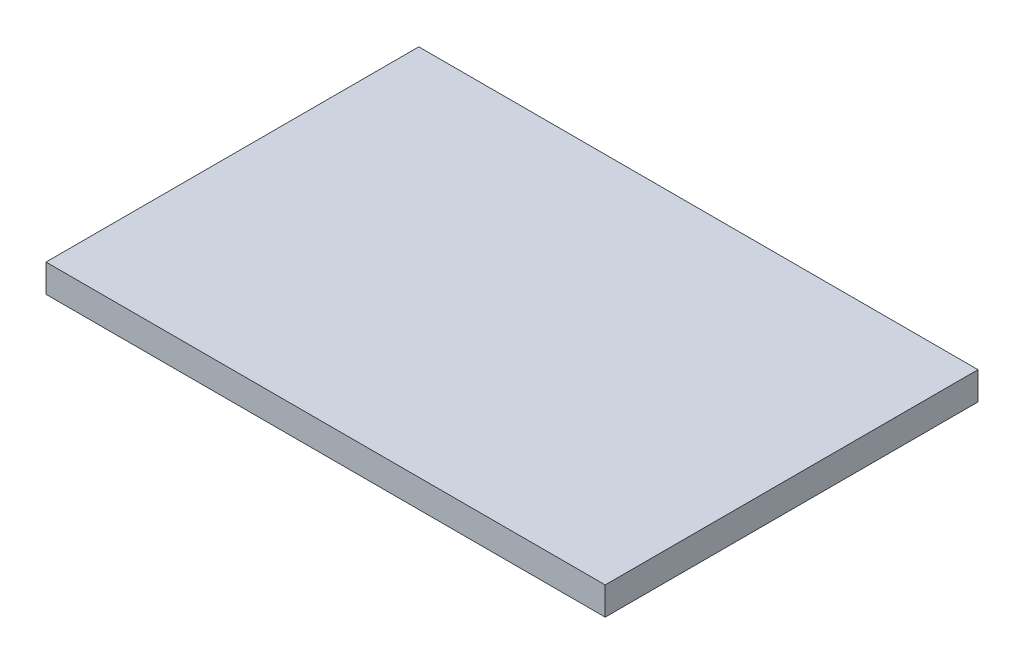
ISO-10303-21;
HEADER;
FILE_DESCRIPTION(('STEP AP214'),'2;1');
FILE_NAME('part.step','',(''),(''),'','','');
FILE_SCHEMA(('AUTOMOTIVE_DESIGN { 1 0 10303 214 1 1 1 1 }'));
ENDSEC;
DATA;
#1=APPLICATION_CONTEXT('core data for automotive mechanical design processes');
#2=APPLICATION_PROTOCOL_DEFINITION('international standard','automotive_design',2000,#1);
#3=PRODUCT_CONTEXT('',#1,'mechanical');
#4=PRODUCT('Part','Part','',(#3));
#5=PRODUCT_RELATED_PRODUCT_CATEGORY('part','',(#4));
#6=PRODUCT_DEFINITION_FORMATION('','',#4);
#7=PRODUCT_DEFINITION_CONTEXT('part definition',#1,'design');
#8=PRODUCT_DEFINITION('design','',#6,#7);
#9=PRODUCT_DEFINITION_SHAPE('','',#8);
#10=(LENGTH_UNIT() NAMED_UNIT(*) SI_UNIT(.MILLI.,.METRE.));
#11=(NAMED_UNIT(*) PLANE_ANGLE_UNIT() SI_UNIT($,.RADIAN.));
#12=(NAMED_UNIT(*) SI_UNIT($,.STERADIAN.) SOLID_ANGLE_UNIT());
#13=UNCERTAINTY_MEASURE_WITH_UNIT(LENGTH_MEASURE(1.E-05),#10,'distance_accuracy_value','');
#14=(GEOMETRIC_REPRESENTATION_CONTEXT(3) GLOBAL_UNCERTAINTY_ASSIGNED_CONTEXT((#13)) GLOBAL_UNIT_ASSIGNED_CONTEXT((#10,
#11,#12)) REPRESENTATION_CONTEXT('',''));
#15=CARTESIAN_POINT('',(0.,0.,0.));
#16=DIRECTION('',(0.,0.,1.));
#17=DIRECTION('',(1.,0.,0.));
#18=AXIS2_PLACEMENT_3D('',#15,#16,#17);
#19=CARTESIAN_POINT('',(30.,3.,20.));
#20=DIRECTION('',(-1.,0.,0.));
#21=DIRECTION('',(0.,0.,1.));
#22=AXIS2_PLACEMENT_3D('',#19,#20,#21);
#23=PLANE('',#22);
#24=DIRECTION('',(0.,0.,-1.));
#25=VECTOR('',#24,1.);
#26=CARTESIAN_POINT('',(30.,0.,20.));
#27=LINE('',#26,#25);
#28=CARTESIAN_POINT('',(30.,0.,20.));
#29=VERTEX_POINT('',#28);
#30=CARTESIAN_POINT('',(30.,0.,-20.));
#31=VERTEX_POINT('',#30);
#32=EDGE_CURVE('E111',#29,#31,#27,.T.);
#33=ORIENTED_EDGE('',*,*,#32,.T.);
#34=DIRECTION('',(0.,-1.,0.));
#35=VECTOR('',#34,1.);
#36=CARTESIAN_POINT('',(30.,3.,-20.));
#37=LINE('',#36,#35);
#38=CARTESIAN_POINT('',(30.,3.,-20.));
#39=VERTEX_POINT('',#38);
#40=EDGE_CURVE('E11',#39,#31,#37,.T.);
#41=ORIENTED_EDGE('',*,*,#40,.F.);
#42=DIRECTION('',(0.,0.,-1.));
#43=VECTOR('',#42,1.);
#44=CARTESIAN_POINT('',(30.,3.,20.));
#45=LINE('',#44,#43);
#46=CARTESIAN_POINT('',(30.,3.,20.));
#47=VERTEX_POINT('',#46);
#48=EDGE_CURVE('E95',#47,#39,#45,.T.);
#49=ORIENTED_EDGE('',*,*,#48,.F.);
#50=DIRECTION('',(0.,-1.,0.));
#51=VECTOR('',#50,1.);
#52=CARTESIAN_POINT('',(30.,3.,20.));
#53=LINE('',#52,#51);
#54=EDGE_CURVE('E107',#47,#29,#53,.T.);
#55=ORIENTED_EDGE('',*,*,#54,.T.);
#56=EDGE_LOOP('',(#33,#41,#49,#55));
#57=FACE_BOUND('',#56,.T.);
#58=ADVANCED_FACE('F43',(#57),#23,.F.);
#59=CARTESIAN_POINT('',(-30.,3.,-20.));
#60=DIRECTION('',(0.,0.,1.));
#61=DIRECTION('',(1.,0.,0.));
#62=AXIS2_PLACEMENT_3D('',#59,#60,#61);
#63=PLANE('',#62);
#64=DIRECTION('',(-1.,0.,0.));
#65=VECTOR('',#64,1.);
#66=CARTESIAN_POINT('',(-30.,0.,-20.));
#67=LINE('',#66,#65);
#68=CARTESIAN_POINT('',(-30.,0.,-20.));
#69=VERTEX_POINT('',#68);
#70=EDGE_CURVE('E100',#31,#69,#67,.T.);
#71=ORIENTED_EDGE('',*,*,#70,.T.);
#72=DIRECTION('',(0.,-1.,0.));
#73=VECTOR('',#72,1.);
#74=CARTESIAN_POINT('',(-30.,3.,-20.));
#75=LINE('',#74,#73);
#76=CARTESIAN_POINT('',(-30.,3.,-20.));
#77=VERTEX_POINT('',#76);
#78=EDGE_CURVE('E52',#77,#69,#75,.T.);
#79=ORIENTED_EDGE('',*,*,#78,.F.);
#80=DIRECTION('',(-1.,0.,0.));
#81=VECTOR('',#80,1.);
#82=CARTESIAN_POINT('',(-30.,3.,-20.));
#83=LINE('',#82,#81);
#84=EDGE_CURVE('E90',#39,#77,#83,.T.);
#85=ORIENTED_EDGE('',*,*,#84,.F.);
#86=ORIENTED_EDGE('',*,*,#40,.T.);
#87=EDGE_LOOP('',(#71,#79,#85,#86));
#88=FACE_BOUND('',#87,.T.);
#89=ADVANCED_FACE('F99',(#88),#63,.F.);
#90=CARTESIAN_POINT('',(-30.,3.,20.));
#91=DIRECTION('',(1.,0.,0.));
#92=DIRECTION('',(0.,0.,-1.));
#93=AXIS2_PLACEMENT_3D('',#90,#91,#92);
#94=PLANE('',#93);
#95=DIRECTION('',(0.,0.,1.));
#96=VECTOR('',#95,1.);
#97=CARTESIAN_POINT('',(-30.,0.,20.));
#98=LINE('',#97,#96);
#99=CARTESIAN_POINT('',(-30.,0.,20.));
#100=VERTEX_POINT('',#99);
#101=EDGE_CURVE('E77',#69,#100,#98,.T.);
#102=ORIENTED_EDGE('',*,*,#101,.T.);
#103=DIRECTION('',(0.,-1.,0.));
#104=VECTOR('',#103,1.);
#105=CARTESIAN_POINT('',(-30.,3.,20.));
#106=LINE('',#105,#104);
#107=CARTESIAN_POINT('',(-30.,3.,20.));
#108=VERTEX_POINT('',#107);
#109=EDGE_CURVE('E102',#108,#100,#106,.T.);
#110=ORIENTED_EDGE('',*,*,#109,.F.);
#111=DIRECTION('',(0.,0.,1.));
#112=VECTOR('',#111,1.);
#113=CARTESIAN_POINT('',(-30.,3.,20.));
#114=LINE('',#113,#112);
#115=EDGE_CURVE('E93',#77,#108,#114,.T.);
#116=ORIENTED_EDGE('',*,*,#115,.F.);
#117=ORIENTED_EDGE('',*,*,#78,.T.);
#118=EDGE_LOOP('',(#102,#110,#116,#117));
#119=FACE_BOUND('',#118,.T.);
#120=ADVANCED_FACE('F103',(#119),#94,.F.);
#121=CARTESIAN_POINT('',(-30.,3.,20.));
#122=DIRECTION('',(0.,0.,-1.));
#123=DIRECTION('',(-1.,0.,0.));
#124=AXIS2_PLACEMENT_3D('',#121,#122,#123);
#125=PLANE('',#124);
#126=DIRECTION('',(1.,0.,0.));
#127=VECTOR('',#126,1.);
#128=CARTESIAN_POINT('',(-30.,0.,20.));
#129=LINE('',#128,#127);
#130=EDGE_CURVE('E83',#100,#29,#129,.T.);
#131=ORIENTED_EDGE('',*,*,#130,.T.);
#132=ORIENTED_EDGE('',*,*,#54,.F.);
#133=DIRECTION('',(1.,0.,0.));
#134=VECTOR('',#133,1.);
#135=CARTESIAN_POINT('',(-30.,3.,20.));
#136=LINE('',#135,#134);
#137=EDGE_CURVE('E60',#108,#47,#136,.T.);
#138=ORIENTED_EDGE('',*,*,#137,.F.);
#139=ORIENTED_EDGE('',*,*,#109,.T.);
#140=EDGE_LOOP('',(#131,#132,#138,#139));
#141=FACE_BOUND('',#140,.T.);
#142=ADVANCED_FACE('F124',(#141),#125,.F.);
#143=CARTESIAN_POINT('',(0.,3.,0.));
#144=DIRECTION('',(0.,-1.,0.));
#145=DIRECTION('',(0.,0.,-1.));
#146=AXIS2_PLACEMENT_3D('',#143,#144,#145);
#147=PLANE('',#146);
#148=ORIENTED_EDGE('',*,*,#48,.T.);
#149=ORIENTED_EDGE('',*,*,#84,.T.);
#150=ORIENTED_EDGE('',*,*,#115,.T.);
#151=ORIENTED_EDGE('',*,*,#137,.T.);
#152=EDGE_LOOP('',(#148,#149,#150,#151));
#153=FACE_BOUND('',#152,.T.);
#154=ADVANCED_FACE('F91',(#153),#147,.F.);
#155=CARTESIAN_POINT('',(0.,0.,0.));
#156=DIRECTION('',(0.,-1.,0.));
#157=DIRECTION('',(0.,0.,-1.));
#158=AXIS2_PLACEMENT_3D('',#155,#156,#157);
#159=PLANE('',#158);
#160=ORIENTED_EDGE('',*,*,#32,.F.);
#161=ORIENTED_EDGE('',*,*,#130,.F.);
#162=ORIENTED_EDGE('',*,*,#101,.F.);
#163=ORIENTED_EDGE('',*,*,#70,.F.);
#164=EDGE_LOOP('',(#160,#161,#162,#163));
#165=FACE_BOUND('',#164,.T.);
#166=ADVANCED_FACE('F127',(#165),#159,.T.);
#167=CLOSED_SHELL('',(#58,#89,#120,#142,#154,#166));
#168=MANIFOLD_SOLID_BREP('B2',#167);
#169=ADVANCED_BREP_SHAPE_REPRESENTATION('',(#18,#168),#14);
#170=SHAPE_DEFINITION_REPRESENTATION(#9,#169);
ENDSEC;
END-ISO-10303-21;
